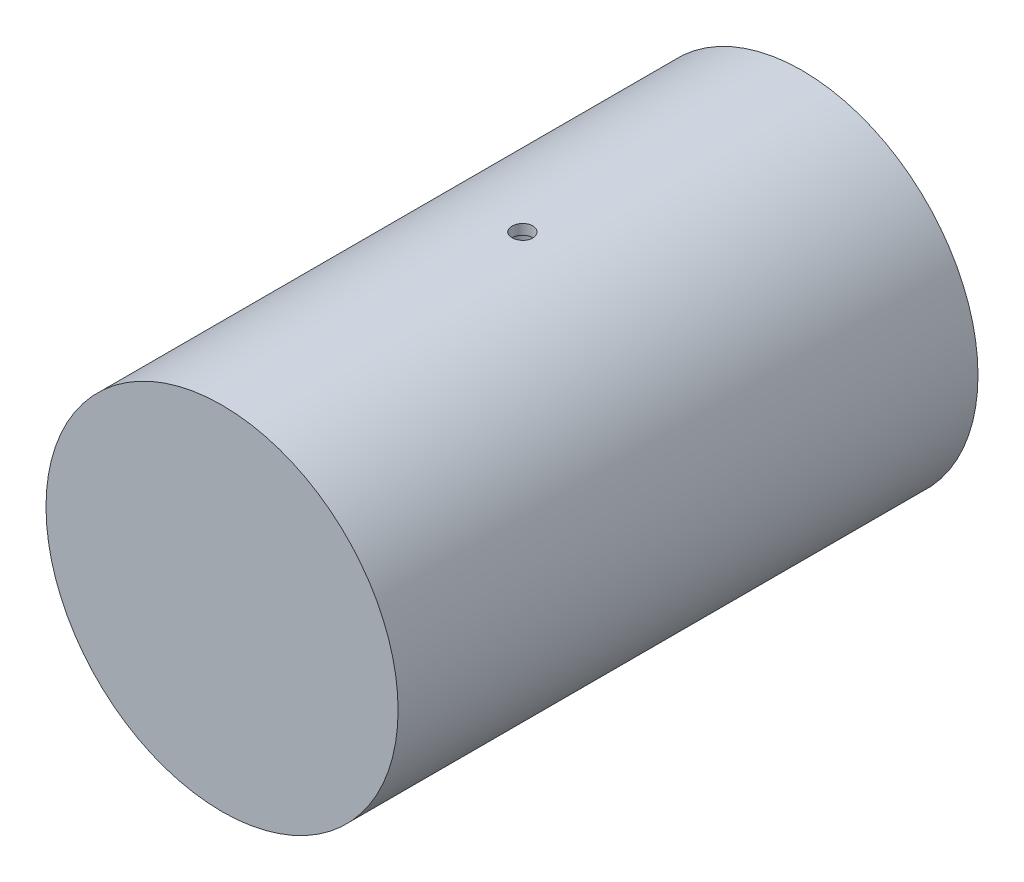
ISO-10303-21;
HEADER;
FILE_DESCRIPTION(('STEP AP214'),'2;1');
FILE_NAME('part.step','',(''),(''),'','','');
FILE_SCHEMA(('AUTOMOTIVE_DESIGN { 1 0 10303 214 1 1 1 1 }'));
ENDSEC;
DATA;
#1=APPLICATION_CONTEXT('core data for automotive mechanical design processes');
#2=APPLICATION_PROTOCOL_DEFINITION('international standard','automotive_design',2000,#1);
#3=PRODUCT_CONTEXT('',#1,'mechanical');
#4=PRODUCT('Part','Part','',(#3));
#5=PRODUCT_RELATED_PRODUCT_CATEGORY('part','',(#4));
#6=PRODUCT_DEFINITION_FORMATION('','',#4);
#7=PRODUCT_DEFINITION_CONTEXT('part definition',#1,'design');
#8=PRODUCT_DEFINITION('design','',#6,#7);
#9=PRODUCT_DEFINITION_SHAPE('','',#8);
#10=(LENGTH_UNIT() NAMED_UNIT(*) SI_UNIT(.MILLI.,.METRE.));
#11=(NAMED_UNIT(*) PLANE_ANGLE_UNIT() SI_UNIT($,.RADIAN.));
#12=(NAMED_UNIT(*) SI_UNIT($,.STERADIAN.) SOLID_ANGLE_UNIT());
#13=UNCERTAINTY_MEASURE_WITH_UNIT(LENGTH_MEASURE(1.E-05),#10,'distance_accuracy_value','');
#14=(GEOMETRIC_REPRESENTATION_CONTEXT(3) GLOBAL_UNCERTAINTY_ASSIGNED_CONTEXT((#13)) GLOBAL_UNIT_ASSIGNED_CONTEXT((#10,
#11,#12)) REPRESENTATION_CONTEXT('',''));
#15=CARTESIAN_POINT('',(0.,0.,0.));
#16=DIRECTION('',(0.,0.,1.));
#17=DIRECTION('',(1.,0.,0.));
#18=AXIS2_PLACEMENT_3D('',#15,#16,#17);
#19=CARTESIAN_POINT('',(0.,0.,-56.));
#20=DIRECTION('',(0.,0.,1.));
#21=DIRECTION('',(1.,0.,0.));
#22=AXIS2_PLACEMENT_3D('',#19,#20,#21);
#23=CYLINDRICAL_SURFACE('',#22,10.);
#24=CARTESIAN_POINT('',(0.,0.,-2.));
#25=DIRECTION('',(0.,0.,1.));
#26=DIRECTION('',(1.,0.,0.));
#27=AXIS2_PLACEMENT_3D('',#24,#25,#26);
#28=CIRCLE('',#27,10.);
#29=CARTESIAN_POINT('',(10.,0.,-2.));
#30=VERTEX_POINT('',#29);
#31=EDGE_CURVE('E213',#30,#30,#28,.T.);
#32=ORIENTED_EDGE('',*,*,#31,.T.);
#33=EDGE_LOOP('',(#32));
#34=FACE_BOUND('',#33,.T.);
#35=CARTESIAN_POINT('',(0.,10.,-27.5));
#36=CARTESIAN_POINT('',(-0.0837515444816424,9.99999865771297,-27.5000034538152));
#37=CARTESIAN_POINT('',(-0.167551685082132,9.9989368253704,-27.5070380008406));
#38=CARTESIAN_POINT('',(-0.332809627994914,9.99480315973187,-27.5349831999828));
#39=CARTESIAN_POINT('',(-0.41426506897423,9.99172936938473,-27.5559073629449));
#40=CARTESIAN_POINT('',(-0.572418086221861,9.98391721219526,-27.6109925049676));
#41=CARTESIAN_POINT('',(-0.649119207826801,9.97918010370919,-27.645143479506));
#42=CARTESIAN_POINT('',(-0.795690428635256,9.96856475911724,-27.7256883794169));
#43=CARTESIAN_POINT('',(-0.86556147472519,9.96268668152773,-27.7720806044174));
#44=CARTESIAN_POINT('',(-0.997046719562127,9.95039170991452,-27.8761772649399));
#45=CARTESIAN_POINT('',(-1.0585998322255,9.94397133890331,-27.9339584562082));
#46=CARTESIAN_POINT('',(-1.17117490668949,9.93134261133238,-28.0590276888939));
#47=CARTESIAN_POINT('',(-1.22219626272936,9.92513426698505,-28.1263162767785));
#48=CARTESIAN_POINT('',(-1.31249729499943,9.91359877458726,-28.2689006435225));
#49=CARTESIAN_POINT('',(-1.35171787037205,9.90827611975031,-28.3442342469813));
#50=CARTESIAN_POINT('',(-1.41692632171056,9.89916211306268,-28.5005128206454));
#51=CARTESIAN_POINT('',(-1.44291491889163,9.89537067775448,-28.5814574847439));
#52=CARTESIAN_POINT('',(-1.48073198798911,9.88978256218673,-28.7460180418717));
#53=CARTESIAN_POINT('',(-1.49266503640518,9.8879711574125,-28.829609393408));
#54=CARTESIAN_POINT('',(-1.50235624033933,9.88650348970582,-28.9976261659873));
#55=CARTESIAN_POINT('',(-1.50011520973796,9.88684710303147,-29.0820515388625));
#56=CARTESIAN_POINT('',(-1.48160733250788,9.88963718352409,-29.2486010801941));
#57=CARTESIAN_POINT('',(-1.4654569592775,9.89206618761549,-29.3307385264848));
#58=CARTESIAN_POINT('',(-1.41977117403734,9.89872608126367,-29.4911243688715));
#59=CARTESIAN_POINT('',(-1.39023538337812,9.90295702179379,-29.5693726548807));
#60=CARTESIAN_POINT('',(-1.31849603529737,9.91276335545481,-29.7201133712829));
#61=CARTESIAN_POINT('',(-1.27624314283198,9.91834396766526,-29.7925819690924));
#62=CARTESIAN_POINT('',(-1.18030413128955,9.93021707574548,-29.9294445957819));
#63=CARTESIAN_POINT('',(-1.12661726182478,9.93650961832501,-29.9938380942694));
#64=CARTESIAN_POINT('',(-1.00869493078248,9.94917473056209,-30.1133976607397));
#65=CARTESIAN_POINT('',(-0.944359329642003,9.95554747112815,-30.1684649902863));
#66=CARTESIAN_POINT('',(-0.807307089894186,9.96759647648462,-30.2670359345073));
#67=CARTESIAN_POINT('',(-0.73459041458817,9.9732727382251,-30.3105394985439));
#68=CARTESIAN_POINT('',(-0.582754598213685,9.98329515585393,-30.3847530864995));
#69=CARTESIAN_POINT('',(-0.503631677836779,9.98764051925428,-30.4154554918403));
#70=CARTESIAN_POINT('',(-0.34127318248706,9.99450490557069,-30.4631093896854));
#71=CARTESIAN_POINT('',(-0.2580378859526,9.99702405195467,-30.4800618118156));
#72=CARTESIAN_POINT('',(-0.0906695676436457,9.99993581133871,-30.4996032298167));
#73=CARTESIAN_POINT('',(-0.0065527318704695,10.0003485209039,-30.5023279713793));
#74=CARTESIAN_POINT('',(0.160936677662284,9.99905561015226,-30.493696994689));
#75=CARTESIAN_POINT('',(0.244309274381878,9.99735005541369,-30.4823417123319));
#76=CARTESIAN_POINT('',(0.40753238743141,9.99202468615333,-30.4459858998225));
#77=CARTESIAN_POINT('',(0.48739796307984,9.98841415207984,-30.4210515039692));
#78=CARTESIAN_POINT('',(0.641814958643002,9.97968235658369,-30.3583150025382));
#79=CARTESIAN_POINT('',(0.716366128795101,9.97456102421565,-30.3205122926664));
#80=CARTESIAN_POINT('',(0.858634979291923,9.96332682468686,-30.2327937754361));
#81=CARTESIAN_POINT('',(0.926299009891568,9.95720701626745,-30.1827918599872));
#82=CARTESIAN_POINT('',(1.05232367317771,9.94467863012165,-30.0722141883713));
#83=CARTESIAN_POINT('',(1.11068376479341,9.93827003562867,-30.0116378176753));
#84=CARTESIAN_POINT('',(1.21693784957196,9.92582264304494,-29.8810264668235));
#85=CARTESIAN_POINT('',(1.26474084747421,9.91978736017588,-29.8109170748052));
#86=CARTESIAN_POINT('',(1.34789129270584,9.90883219104903,-29.6635839594882));
#87=CARTESIAN_POINT('',(1.38323907656436,9.90391227465628,-29.5863604284785));
#88=CARTESIAN_POINT('',(1.44033467323943,9.89577033008645,-29.4272624663769));
#89=CARTESIAN_POINT('',(1.46213037141635,9.89254233006438,-29.3454055390288));
#90=CARTESIAN_POINT('',(1.49165549501586,9.88813382297802,-29.1791409845649));
#91=CARTESIAN_POINT('',(1.49938589183067,9.88695317451771,-29.0947335340053));
#92=CARTESIAN_POINT('',(1.5005378666944,9.88677832610841,-28.9266709366842));
#93=CARTESIAN_POINT('',(1.49410252167313,9.88776226333502,-28.8430167582431));
#94=CARTESIAN_POINT('',(1.46741229544379,9.89175820611174,-28.6779947366765));
#95=CARTESIAN_POINT('',(1.44715743638627,9.89477020841117,-28.5966268898866));
#96=CARTESIAN_POINT('',(1.39345373518665,9.90247526112297,-28.4385269177657));
#97=CARTESIAN_POINT('',(1.36001489324314,9.90716703716075,-28.3617913295666));
#98=CARTESIAN_POINT('',(1.28090667642309,9.91770454557702,-28.2149963661976));
#99=CARTESIAN_POINT('',(1.23523688741502,9.92355031702724,-28.1449372171964));
#100=CARTESIAN_POINT('',(1.13244337659164,9.93580743364938,-28.0127569420248));
#101=CARTESIAN_POINT('',(1.07521369039806,9.94222367881967,-27.9507186667529));
#102=CARTESIAN_POINT('',(0.951148841082837,9.95485788826636,-27.8370754452122));
#103=CARTESIAN_POINT('',(0.884311448350943,9.96107580610759,-27.7854729274238));
#104=CARTESIAN_POINT('',(0.742495707543723,9.9726518579052,-27.6939123233926));
#105=CARTESIAN_POINT('',(0.667474576764761,9.9780050712882,-27.6540198907853));
#106=CARTESIAN_POINT('',(0.51175187024872,9.98720028802959,-27.587461483242));
#107=CARTESIAN_POINT('',(0.431056277096705,9.99104385565757,-27.5607818099463));
#108=CARTESIAN_POINT('',(0.29166572788933,9.99590939261505,-27.5274586572899));
#109=CARTESIAN_POINT('',(0.233831133495279,9.99743549179557,-27.5171773984612));
#110=CARTESIAN_POINT('',(0.117338971600125,9.99948125947896,-27.5034469022874));
#111=CARTESIAN_POINT('',(0.0586814143344172,10.0000009404877,-27.4999975800475));
#112=CARTESIAN_POINT('',(0.,10.,-27.5));
#113=B_SPLINE_CURVE_WITH_KNOTS('',3,(#35,#36,#37,#38,#39,#40,#41,#42,#43,#44,#45,#46,#47,#48,
#49,#50,#51,#52,#53,#54,#55,#56,#57,#58,#59,#60,#61,#62,#63,#64,#65,#66,#67,#68,#69,#70,#71,#72,
#73,#74,#75,#76,#77,#78,#79,#80,#81,#82,#83,#84,#85,#86,#87,#88,#89,#90,#91,#92,#93,#94,#95,#96,
#97,#98,#99,#100,#101,#102,#103,#104,#105,#106,#107,#108,#109,#110,#111,#112),.UNSPECIFIED.,.T.,
.F.,(4,2,2,2,2,2,2,2,2,2,2,2,2,2,2,2,2,2,2,2,2,2,2,2,2,2,2,2,2,2,2,2,2,2,2,2,2,2,4),(0.,
0.251040205031664,0.502324962929151,0.753420023583239,1.0044802241976,1.25729416136843,
1.5101226357258,1.76419702395375,2.01825756225506,2.27041564605925,2.52255925098983,
2.77261177195747,3.02267136690361,3.27371383476159,3.52477278308535,3.77834291255409,
4.03191415238669,4.28563608984875,4.53934087193402,4.79062058544256,5.04189251991155,
5.29195148965949,5.54202220376274,5.79391188036908,6.0458162002863,6.29981366584672,
6.55380426808833,6.80689223457168,7.05996272137177,7.31048888261065,7.56101464229565,
7.81135073984148,8.06169531466881,8.31444829965721,8.56726003468734,8.82146323384734,
9.07540233261442,9.25129851978809,9.42719252123292),.UNSPECIFIED.);
#114=CARTESIAN_POINT('',(0.,10.,-27.5));
#115=VERTEX_POINT('',#114);
#116=EDGE_CURVE('E141',#115,#115,#113,.T.);
#117=ORIENTED_EDGE('',*,*,#116,.F.);
#118=EDGE_LOOP('',(#117));
#119=FACE_BOUND('',#118,.T.);
#120=CARTESIAN_POINT('',(0.,0.,-54.));
#121=DIRECTION('',(0.,0.,-1.));
#122=DIRECTION('',(-1.,0.,0.));
#123=AXIS2_PLACEMENT_3D('',#120,#121,#122);
#124=CIRCLE('',#123,10.);
#125=CARTESIAN_POINT('',(-10.,0.,-54.));
#126=VERTEX_POINT('',#125);
#127=EDGE_CURVE('E53',#126,#126,#124,.F.);
#128=ORIENTED_EDGE('',*,*,#127,.F.);
#129=EDGE_LOOP('',(#128));
#130=FACE_BOUND('',#129,.T.);
#131=ADVANCED_FACE('F39',(#34,#119,#130),#23,.F.);
#132=CARTESIAN_POINT('',(0.,0.,-2.));
#133=DIRECTION('',(0.,0.,1.));
#134=DIRECTION('',(1.,0.,0.));
#135=AXIS2_PLACEMENT_3D('',#132,#133,#134);
#136=PLANE('',#135);
#137=ORIENTED_EDGE('',*,*,#31,.F.);
#138=EDGE_LOOP('',(#137));
#139=FACE_BOUND('',#138,.T.);
#140=ADVANCED_FACE('F166',(#139),#136,.F.);
#141=CARTESIAN_POINT('',(0.,16.,0.));
#142=DIRECTION('',(0.,1.,0.));
#143=DIRECTION('',(0.,0.,1.));
#144=AXIS2_PLACEMENT_3D('',#141,#142,#143);
#145=PLANE('',#144);
#146=CARTESIAN_POINT('',(0.,16.,-29.));
#147=DIRECTION('',(0.,1.,0.));
#148=DIRECTION('',(0.,0.,1.));
#149=AXIS2_PLACEMENT_3D('',#146,#147,#148);
#150=CIRCLE('',#149,1.);
#151=CARTESIAN_POINT('',(0.,16.,-28.));
#152=VERTEX_POINT('',#151);
#153=EDGE_CURVE('E133',#152,#152,#150,.F.);
#154=ORIENTED_EDGE('',*,*,#153,.F.);
#155=EDGE_LOOP('',(#154));
#156=FACE_BOUND('',#155,.T.);
#157=CARTESIAN_POINT('',(0.,16.,-29.));
#158=DIRECTION('',(0.,1.,0.));
#159=DIRECTION('',(0.,0.,1.));
#160=AXIS2_PLACEMENT_3D('',#157,#158,#159);
#161=CIRCLE('',#160,1.5);
#162=CARTESIAN_POINT('',(0.,16.,-27.5));
#163=VERTEX_POINT('',#162);
#164=EDGE_CURVE('E156',#163,#163,#161,.T.);
#165=ORIENTED_EDGE('',*,*,#164,.F.);
#166=EDGE_LOOP('',(#165));
#167=FACE_BOUND('',#166,.T.);
#168=ADVANCED_FACE('F163',(#156,#167),#145,.F.);
#169=CARTESIAN_POINT('',(0.,-17.001,-29.));
#170=DIRECTION('',(0.,1.,0.));
#171=DIRECTION('',(0.,0.,1.));
#172=AXIS2_PLACEMENT_3D('',#169,#170,#171);
#173=CYLINDRICAL_SURFACE('',#172,1.5);
#174=ORIENTED_EDGE('',*,*,#164,.T.);
#175=EDGE_LOOP('',(#174));
#176=FACE_BOUND('',#175,.T.);
#177=ORIENTED_EDGE('',*,*,#116,.T.);
#178=EDGE_LOOP('',(#177));
#179=FACE_BOUND('',#178,.T.);
#180=ADVANCED_FACE('F158',(#176,#179),#173,.F.);
#181=CARTESIAN_POINT('',(0.,0.,-54.));
#182=DIRECTION('',(0.,0.,-1.));
#183=DIRECTION('',(-1.,0.,0.));
#184=AXIS2_PLACEMENT_3D('',#181,#182,#183);
#185=CYLINDRICAL_SURFACE('',#184,5.);
#186=CARTESIAN_POINT('',(0.,0.,-56.));
#187=DIRECTION('',(0.,0.,-1.));
#188=DIRECTION('',(-1.,0.,0.));
#189=AXIS2_PLACEMENT_3D('',#186,#187,#188);
#190=CIRCLE('',#189,5.);
#191=CARTESIAN_POINT('',(1.95959179422654,4.6,-56.));
#192=VERTEX_POINT('',#191);
#193=CARTESIAN_POINT('',(4.78340576371954,-1.45568859980928,-56.));
#194=VERTEX_POINT('',#193);
#195=EDGE_CURVE('E129',#192,#194,#190,.T.);
#196=ORIENTED_EDGE('',*,*,#195,.T.);
#197=DIRECTION('',(0.,0.,-1.));
#198=VECTOR('',#197,1.);
#199=CARTESIAN_POINT('',(4.78340576371954,-1.45568859980928,-54.));
#200=LINE('',#199,#198);
#201=CARTESIAN_POINT('',(4.78340576371954,-1.45568859980928,-54.));
#202=VERTEX_POINT('',#201);
#203=EDGE_CURVE('E139',#202,#194,#200,.T.);
#204=ORIENTED_EDGE('',*,*,#203,.F.);
#205=CARTESIAN_POINT('',(0.,0.,-54.));
#206=DIRECTION('',(0.,0.,-1.));
#207=DIRECTION('',(-1.,0.,0.));
#208=AXIS2_PLACEMENT_3D('',#205,#206,#207);
#209=CIRCLE('',#208,5.);
#210=CARTESIAN_POINT('',(1.95959179422654,4.6,-54.));
#211=VERTEX_POINT('',#210);
#212=EDGE_CURVE('E111',#211,#202,#209,.T.);
#213=ORIENTED_EDGE('',*,*,#212,.F.);
#214=DIRECTION('',(0.,0.,-1.));
#215=VECTOR('',#214,1.);
#216=CARTESIAN_POINT('',(1.95959179422654,4.6,-54.));
#217=LINE('',#216,#215);
#218=EDGE_CURVE('E128',#211,#192,#217,.T.);
#219=ORIENTED_EDGE('',*,*,#218,.T.);
#220=EDGE_LOOP('',(#196,#204,#213,#219));
#221=FACE_BOUND('',#220,.T.);
#222=ADVANCED_FACE('F178',(#221),#185,.F.);
#223=CARTESIAN_POINT('',(3.8302222155949,-3.21393804843269,-54.));
#224=DIRECTION('',(0.,0.,-1.));
#225=DIRECTION('',(-1.,0.,0.));
#226=AXIS2_PLACEMENT_3D('',#223,#224,#225);
#227=CYLINDRICAL_SURFACE('',#226,2.);
#228=CARTESIAN_POINT('',(3.8302222155949,-3.21393804843269,-56.));
#229=DIRECTION('',(0.,0.,-1.));
#230=DIRECTION('',(-1.,0.,0.));
#231=AXIS2_PLACEMENT_3D('',#228,#229,#230);
#232=CIRCLE('',#231,2.);
#233=CARTESIAN_POINT('',(2.26420311297507,-4.45795740930687,-56.));
#234=VERTEX_POINT('',#233);
#235=EDGE_CURVE('E81',#194,#234,#232,.T.);
#236=ORIENTED_EDGE('',*,*,#235,.T.);
#237=DIRECTION('',(0.,0.,-1.));
#238=VECTOR('',#237,1.);
#239=CARTESIAN_POINT('',(2.26420311297507,-4.45795740930687,-54.));
#240=LINE('',#239,#238);
#241=CARTESIAN_POINT('',(2.26420311297507,-4.45795740930687,-54.));
#242=VERTEX_POINT('',#241);
#243=EDGE_CURVE('E118',#242,#234,#240,.T.);
#244=ORIENTED_EDGE('',*,*,#243,.F.);
#245=CARTESIAN_POINT('',(3.8302222155949,-3.21393804843269,-54.));
#246=DIRECTION('',(0.,0.,-1.));
#247=DIRECTION('',(-1.,0.,0.));
#248=AXIS2_PLACEMENT_3D('',#245,#246,#247);
#249=CIRCLE('',#248,2.);
#250=EDGE_CURVE('E61',#202,#242,#249,.T.);
#251=ORIENTED_EDGE('',*,*,#250,.F.);
#252=ORIENTED_EDGE('',*,*,#203,.T.);
#253=EDGE_LOOP('',(#236,#244,#251,#252));
#254=FACE_BOUND('',#253,.T.);
#255=ADVANCED_FACE('F177',(#254),#227,.F.);
#256=CARTESIAN_POINT('',(-2.26420311297507,-4.45795740930687,-56.));
#257=VERTEX_POINT('',#256);
#258=EDGE_CURVE('E115',#234,#257,#190,.T.);
#259=ORIENTED_EDGE('',*,*,#258,.T.);
#260=DIRECTION('',(0.,0.,-1.));
#261=VECTOR('',#260,1.);
#262=CARTESIAN_POINT('',(-2.26420311297507,-4.45795740930687,-54.));
#263=LINE('',#262,#261);
#264=CARTESIAN_POINT('',(-2.26420311297507,-4.45795740930687,-54.));
#265=VERTEX_POINT('',#264);
#266=EDGE_CURVE('E113',#265,#257,#263,.T.);
#267=ORIENTED_EDGE('',*,*,#266,.F.);
#268=EDGE_CURVE('E101',#242,#265,#209,.T.);
#269=ORIENTED_EDGE('',*,*,#268,.F.);
#270=ORIENTED_EDGE('',*,*,#243,.T.);
#271=EDGE_LOOP('',(#259,#267,#269,#270));
#272=FACE_BOUND('',#271,.T.);
#273=ADVANCED_FACE('F114',(#272),#185,.F.);
#274=CARTESIAN_POINT('',(-3.8302222155949,-3.21393804843269,-54.));
#275=DIRECTION('',(0.,0.,-1.));
#276=DIRECTION('',(-1.,0.,0.));
#277=AXIS2_PLACEMENT_3D('',#274,#275,#276);
#278=CYLINDRICAL_SURFACE('',#277,2.);
#279=CARTESIAN_POINT('',(-3.8302222155949,-3.21393804843269,-56.));
#280=DIRECTION('',(0.,0.,-1.));
#281=DIRECTION('',(-1.,0.,0.));
#282=AXIS2_PLACEMENT_3D('',#279,#280,#281);
#283=CIRCLE('',#282,2.);
#284=CARTESIAN_POINT('',(-4.78340576371954,-1.45568859980928,-56.));
#285=VERTEX_POINT('',#284);
#286=EDGE_CURVE('E136',#257,#285,#283,.T.);
#287=ORIENTED_EDGE('',*,*,#286,.T.);
#288=DIRECTION('',(0.,0.,-1.));
#289=VECTOR('',#288,1.);
#290=CARTESIAN_POINT('',(-4.78340576371954,-1.45568859980928,-54.));
#291=LINE('',#290,#289);
#292=CARTESIAN_POINT('',(-4.78340576371954,-1.45568859980928,-54.));
#293=VERTEX_POINT('',#292);
#294=EDGE_CURVE('E119',#293,#285,#291,.T.);
#295=ORIENTED_EDGE('',*,*,#294,.F.);
#296=CARTESIAN_POINT('',(-3.8302222155949,-3.21393804843269,-54.));
#297=DIRECTION('',(0.,0.,-1.));
#298=DIRECTION('',(-1.,0.,0.));
#299=AXIS2_PLACEMENT_3D('',#296,#297,#298);
#300=CIRCLE('',#299,2.);
#301=EDGE_CURVE('E106',#265,#293,#300,.T.);
#302=ORIENTED_EDGE('',*,*,#301,.F.);
#303=ORIENTED_EDGE('',*,*,#266,.T.);
#304=EDGE_LOOP('',(#287,#295,#302,#303));
#305=FACE_BOUND('',#304,.T.);
#306=ADVANCED_FACE('F121',(#305),#278,.F.);
#307=CARTESIAN_POINT('',(-1.95959179422654,4.6,-56.));
#308=VERTEX_POINT('',#307);
#309=EDGE_CURVE('E134',#285,#308,#190,.T.);
#310=ORIENTED_EDGE('',*,*,#309,.T.);
#311=DIRECTION('',(0.,0.,-1.));
#312=VECTOR('',#311,1.);
#313=CARTESIAN_POINT('',(-1.95959179422654,4.6,-54.));
#314=LINE('',#313,#312);
#315=CARTESIAN_POINT('',(-1.95959179422654,4.6,-54.));
#316=VERTEX_POINT('',#315);
#317=EDGE_CURVE('E144',#316,#308,#314,.T.);
#318=ORIENTED_EDGE('',*,*,#317,.F.);
#319=EDGE_CURVE('E110',#293,#316,#209,.T.);
#320=ORIENTED_EDGE('',*,*,#319,.F.);
#321=ORIENTED_EDGE('',*,*,#294,.T.);
#322=EDGE_LOOP('',(#310,#318,#320,#321));
#323=FACE_BOUND('',#322,.T.);
#324=ADVANCED_FACE('F171',(#323),#185,.F.);
#325=CARTESIAN_POINT('',(0.,5.,-54.));
#326=DIRECTION('',(0.,0.,-1.));
#327=DIRECTION('',(-1.,0.,0.));
#328=AXIS2_PLACEMENT_3D('',#325,#326,#327);
#329=CYLINDRICAL_SURFACE('',#328,2.);
#330=CARTESIAN_POINT('',(0.,5.,-56.));
#331=DIRECTION('',(0.,0.,-1.));
#332=DIRECTION('',(-1.,0.,0.));
#333=AXIS2_PLACEMENT_3D('',#330,#331,#332);
#334=CIRCLE('',#333,2.);
#335=EDGE_CURVE('E132',#308,#192,#334,.T.);
#336=ORIENTED_EDGE('',*,*,#335,.T.);
#337=ORIENTED_EDGE('',*,*,#218,.F.);
#338=CARTESIAN_POINT('',(0.,5.,-54.));
#339=DIRECTION('',(0.,0.,-1.));
#340=DIRECTION('',(-1.,0.,0.));
#341=AXIS2_PLACEMENT_3D('',#338,#339,#340);
#342=CIRCLE('',#341,2.);
#343=EDGE_CURVE('E93',#316,#211,#342,.T.);
#344=ORIENTED_EDGE('',*,*,#343,.F.);
#345=ORIENTED_EDGE('',*,*,#317,.T.);
#346=EDGE_LOOP('',(#336,#337,#344,#345));
#347=FACE_BOUND('',#346,.T.);
#348=ADVANCED_FACE('F168',(#347),#329,.F.);
#349=CARTESIAN_POINT('',(0.,0.,-54.));
#350=DIRECTION('',(0.,0.,-1.));
#351=DIRECTION('',(-1.,0.,0.));
#352=AXIS2_PLACEMENT_3D('',#349,#350,#351);
#353=PLANE('',#352);
#354=ORIENTED_EDGE('',*,*,#212,.T.);
#355=ORIENTED_EDGE('',*,*,#250,.T.);
#356=ORIENTED_EDGE('',*,*,#268,.T.);
#357=ORIENTED_EDGE('',*,*,#301,.T.);
#358=ORIENTED_EDGE('',*,*,#319,.T.);
#359=ORIENTED_EDGE('',*,*,#343,.T.);
#360=EDGE_LOOP('',(#354,#355,#356,#357,#358,#359));
#361=FACE_BOUND('',#360,.T.);
#362=ORIENTED_EDGE('',*,*,#127,.T.);
#363=EDGE_LOOP('',(#362));
#364=FACE_BOUND('',#363,.T.);
#365=ADVANCED_FACE('F103',(#361,#364),#353,.F.);
#366=CARTESIAN_POINT('',(0.,0.,0.));
#367=DIRECTION('',(0.,0.,1.));
#368=DIRECTION('',(1.,0.,0.));
#369=AXIS2_PLACEMENT_3D('',#366,#367,#368);
#370=PLANE('',#369);
#371=CARTESIAN_POINT('',(0.,0.,0.));
#372=DIRECTION('',(0.,0.,1.));
#373=DIRECTION('',(1.,0.,0.));
#374=AXIS2_PLACEMENT_3D('',#371,#372,#373);
#375=CIRCLE('',#374,17.);
#376=CARTESIAN_POINT('',(17.,0.,0.));
#377=VERTEX_POINT('',#376);
#378=EDGE_CURVE('E211',#377,#377,#375,.T.);
#379=ORIENTED_EDGE('',*,*,#378,.T.);
#380=EDGE_LOOP('',(#379));
#381=FACE_BOUND('',#380,.T.);
#382=ADVANCED_FACE('F182',(#381),#370,.T.);
#383=CARTESIAN_POINT('',(0.,0.,-2.));
#384=DIRECTION('',(0.,0.,1.));
#385=DIRECTION('',(1.,0.,0.));
#386=AXIS2_PLACEMENT_3D('',#383,#384,#385);
#387=CYLINDRICAL_SURFACE('',#386,17.);
#388=CARTESIAN_POINT('',(0.,17.,-28.));
#389=CARTESIAN_POINT('',(0.0561183746501264,16.9999996082067,-28.0000024716357));
#390=CARTESIAN_POINT('',(0.112276202860598,16.9997191499508,-28.0047397791588));
#391=CARTESIAN_POINT('',(0.223041674009741,16.9986273089947,-28.023570099752));
#392=CARTESIAN_POINT('',(0.277647427794243,16.99781530595,-28.0376740445267));
#393=CARTESIAN_POINT('',(0.38368824240781,16.995752249275,-28.0748315492316));
#394=CARTESIAN_POINT('',(0.435124941635176,16.9945014247927,-28.0978804388714));
#395=CARTESIAN_POINT('',(0.533385723026011,16.9917014683063,-28.1522661123082));
#396=CARTESIAN_POINT('',(0.580210868421177,16.9901524053082,-28.1836009795363));
#397=CARTESIAN_POINT('',(0.667995846390313,16.9869278107431,-28.253715430904));
#398=CARTESIAN_POINT('',(0.708948680843567,16.9852521318566,-28.2925037707974));
#399=CARTESIAN_POINT('',(0.7837667438938,16.981964425654,-28.3764062019085));
#400=CARTESIAN_POINT('',(0.81763167845635,16.9803524009807,-28.4215205554249));
#401=CARTESIAN_POINT('',(0.87733364496531,16.9773726782667,-28.516833291706));
#402=CARTESIAN_POINT('',(0.90316494942709,16.9760051548342,-28.5670352679796));
#403=CARTESIAN_POINT('',(0.946029728558036,16.9736705291336,-28.6710729792676));
#404=CARTESIAN_POINT('',(0.963063288989445,16.9727034229622,-28.7249086788539));
#405=CARTESIAN_POINT('',(0.987829865943245,16.9712800777172,-28.8346189583736));
#406=CARTESIAN_POINT('',(0.995573725716119,16.9708232430806,-28.8904910826436));
#407=CARTESIAN_POINT('',(1.00157454952996,16.9704701732292,-29.0027439105296));
#408=CARTESIAN_POINT('',(0.999831610675698,16.9705739322763,-29.0591246089339));
#409=CARTESIAN_POINT('',(0.986917320304146,16.9713297958248,-29.1707203170552));
#410=CARTESIAN_POINT('',(0.975757696579302,16.9719812182477,-29.2259366892192));
#411=CARTESIAN_POINT('',(0.94434500290671,16.9737579197931,-29.3337110780658));
#412=CARTESIAN_POINT('',(0.924091883555518,16.9748832014898,-29.3862690803043));
#413=CARTESIAN_POINT('',(0.875053770991126,16.9774815896434,-29.4872725128612));
#414=CARTESIAN_POINT('',(0.846263449215765,16.9789549132162,-29.5357153503011));
#415=CARTESIAN_POINT('',(0.78097205059819,16.9820831249695,-29.6270849885991));
#416=CARTESIAN_POINT('',(0.744470897297473,16.9837380149503,-29.6700117347543));
#417=CARTESIAN_POINT('',(0.664727875730669,16.9870458854863,-29.7491988998026));
#418=CARTESIAN_POINT('',(0.621475855871977,16.9886988593262,-29.7854490969132));
#419=CARTESIAN_POINT('',(0.529494483315231,16.9918141927135,-29.8501753337895));
#420=CARTESIAN_POINT('',(0.480765128899694,16.9932765522012,-29.8786513711176));
#421=CARTESIAN_POINT('',(0.379206204412818,16.9958459622978,-29.9270200568789));
#422=CARTESIAN_POINT('',(0.326376454135523,16.9969529972799,-29.9469123278169));
#423=CARTESIAN_POINT('',(0.218119112458328,16.9986867904689,-29.9775420306861));
#424=CARTESIAN_POINT('',(0.162691547948043,16.999313553646,-29.9882795573548));
#425=CARTESIAN_POINT('',(0.050900666474477,17.0000155334865,-30.0002823282654));
#426=CARTESIAN_POINT('',(-0.005461127958274,17.0000915731607,-30.0015617069878));
#427=CARTESIAN_POINT('',(-0.1175985454968,16.9996857248861,-29.9946487821063));
#428=CARTESIAN_POINT('',(-0.173374171298664,16.9992038395046,-29.9864565220866));
#429=CARTESIAN_POINT('',(-0.282716235495461,16.9977369278617,-29.9608445697599));
#430=CARTESIAN_POINT('',(-0.336284195719763,16.9967522546801,-29.9434313524977));
#431=CARTESIAN_POINT('',(-0.439737273498814,16.9943905722397,-29.8998783554226));
#432=CARTESIAN_POINT('',(-0.489622361686738,16.9930135598529,-29.8737385060336));
#433=CARTESIAN_POINT('',(-0.584358423026641,16.9900199316599,-29.8134382121784));
#434=CARTESIAN_POINT('',(-0.629203371432839,16.9884030343495,-29.7792683165885));
#435=CARTESIAN_POINT('',(-0.712525543101089,16.9851125847618,-29.7038916612643));
#436=CARTESIAN_POINT('',(-0.751002710614035,16.9834390319887,-29.662684839929));
#437=CARTESIAN_POINT('',(-0.820544882253057,16.9802215212302,-29.574343117712));
#438=CARTESIAN_POINT('',(-0.851600724421362,16.978677724943,-29.5272009978921));
#439=CARTESIAN_POINT('',(-0.905356030704418,16.9758963846561,-29.4283632127282));
#440=CARTESIAN_POINT('',(-0.928055541566714,16.9746588389431,-29.3766675728599));
#441=CARTESIAN_POINT('',(-0.964437928879209,16.9726307209231,-29.270223813434));
#442=CARTESIAN_POINT('',(-0.97812659534078,16.9718398616394,-29.2154776785844));
#443=CARTESIAN_POINT('',(-0.996117641244239,16.9707935026047,-29.1044593375797));
#444=CARTESIAN_POINT('',(-1.00042010116884,16.9705379982633,-29.0481871445141));
#445=CARTESIAN_POINT('',(-0.999515838122645,16.9705912734493,-28.935805174045));
#446=CARTESIAN_POINT('',(-0.994323521596244,16.9708991980853,-28.8796952797475));
#447=CARTESIAN_POINT('',(-0.974606937601246,16.9720428201189,-28.7691454304075));
#448=CARTESIAN_POINT('',(-0.96008265292127,16.9728785184899,-28.7147054784451));
#449=CARTESIAN_POINT('',(-0.922117583314701,16.9749833032909,-28.6090384526631));
#450=CARTESIAN_POINT('',(-0.898676815664675,16.9762523888812,-28.5578113726184));
#451=CARTESIAN_POINT('',(-0.843546281111595,16.9790808989316,-28.4600182342922));
#452=CARTESIAN_POINT('',(-0.811856740354144,16.9806403154317,-28.4134520482776));
#453=CARTESIAN_POINT('',(-0.741075329876088,16.9838764922282,-28.3262297411644));
#454=CARTESIAN_POINT('',(-0.701973132288073,16.9855534141621,-28.2855820074944));
#455=CARTESIAN_POINT('',(-0.617488612819354,16.9888343021954,-28.2114140992484));
#456=CARTESIAN_POINT('',(-0.572104754109951,16.9904382503136,-28.1778956739867));
#457=CARTESIAN_POINT('',(-0.476298644798581,16.9933939396066,-28.1189160450468));
#458=CARTESIAN_POINT('',(-0.425870669756793,16.9947453891248,-28.0934641355258));
#459=CARTESIAN_POINT('',(-0.321486229260541,16.9970397610062,-28.0514192433704));
#460=CARTESIAN_POINT('',(-0.267533991546778,16.9979831628725,-28.0348158573422));
#461=CARTESIAN_POINT('',(-0.177708363856153,16.9991071850645,-28.0152672896781));
#462=CARTESIAN_POINT('',(-0.142415986844461,16.9994405079764,-28.0095494294173));
#463=CARTESIAN_POINT('',(-0.0714210672826123,16.9998870399963,-28.0019150002994));
#464=CARTESIAN_POINT('',(-0.0357185252291029,17.0000002493707,-27.99999842684));
#465=CARTESIAN_POINT('',(0.,17.,-28.));
#466=B_SPLINE_CURVE_WITH_KNOTS('',3,(#388,#389,#390,#391,#392,#393,#394,#395,#396,#397,#398,
#399,#400,#401,#402,#403,#404,#405,#406,#407,#408,#409,#410,#411,#412,#413,#414,#415,#416,#417,
#418,#419,#420,#421,#422,#423,#424,#425,#426,#427,#428,#429,#430,#431,#432,#433,#434,#435,#436,
#437,#438,#439,#440,#441,#442,#443,#444,#445,#446,#447,#448,#449,#450,#451,#452,#453,#454,#455,
#456,#457,#458,#459,#460,#461,#462,#463,#464,#465),.UNSPECIFIED.,.T.,.F.,(4,2,2,2,2,2,2,2,2,2,2,
2,2,2,2,2,2,2,2,2,2,2,2,2,2,2,2,2,2,2,2,2,2,2,2,2,2,2,4),(0.,0.168224732642648,
0.336646144457545,0.504979738968159,0.673274431475586,0.841768045505397,1.01026864793928,
1.17888910701349,1.34750792230927,1.51592972796072,1.68434980968695,1.85256044557549,
2.02077199533541,2.18908875744697,2.35740718861998,2.52598121089487,2.69455528602827,
2.86313677392696,3.03171651724715,3.20004427997714,3.36837126814283,3.5365802119171,
3.7047904968266,3.87319976059687,4.04161049869066,4.21022808551262,4.37884472902851,
4.54735292013826,4.71585966635655,4.88411094904949,5.05236254205688,5.22061380906182,
5.38886046383207,5.55734327857491,5.72586738628295,5.89458496572892,6.06310374031495,
6.17017645347565,6.27724903700141),.UNSPECIFIED.);
#467=CARTESIAN_POINT('',(0.,17.,-28.));
#468=VERTEX_POINT('',#467);
#469=EDGE_CURVE('E11',#468,#468,#466,.T.);
#470=ORIENTED_EDGE('',*,*,#469,.F.);
#471=EDGE_LOOP('',(#470));
#472=FACE_BOUND('',#471,.T.);
#473=ORIENTED_EDGE('',*,*,#378,.F.);
#474=EDGE_LOOP('',(#473));
#475=FACE_BOUND('',#474,.T.);
#476=CARTESIAN_POINT('',(0.,0.,-56.));
#477=DIRECTION('',(0.,0.,1.));
#478=DIRECTION('',(1.,0.,0.));
#479=AXIS2_PLACEMENT_3D('',#476,#477,#478);
#480=CIRCLE('',#479,17.);
#481=CARTESIAN_POINT('',(17.,0.,-56.));
#482=VERTEX_POINT('',#481);
#483=EDGE_CURVE('E214',#482,#482,#480,.T.);
#484=ORIENTED_EDGE('',*,*,#483,.T.);
#485=EDGE_LOOP('',(#484));
#486=FACE_BOUND('',#485,.T.);
#487=ADVANCED_FACE('F41',(#472,#475,#486),#387,.T.);
#488=CARTESIAN_POINT('',(0.,0.,-56.));
#489=DIRECTION('',(0.,0.,1.));
#490=DIRECTION('',(1.,0.,0.));
#491=AXIS2_PLACEMENT_3D('',#488,#489,#490);
#492=PLANE('',#491);
#493=ORIENTED_EDGE('',*,*,#483,.F.);
#494=EDGE_LOOP('',(#493));
#495=FACE_BOUND('',#494,.T.);
#496=ORIENTED_EDGE('',*,*,#195,.F.);
#497=ORIENTED_EDGE('',*,*,#335,.F.);
#498=ORIENTED_EDGE('',*,*,#309,.F.);
#499=ORIENTED_EDGE('',*,*,#286,.F.);
#500=ORIENTED_EDGE('',*,*,#258,.F.);
#501=ORIENTED_EDGE('',*,*,#235,.F.);
#502=EDGE_LOOP('',(#496,#497,#498,#499,#500,#501));
#503=FACE_BOUND('',#502,.T.);
#504=ADVANCED_FACE('F186',(#495,#503),#492,.F.);
#505=CARTESIAN_POINT('',(0.,13.1715728752538,-29.));
#506=DIRECTION('',(0.,1.,0.));
#507=DIRECTION('',(0.,0.,1.));
#508=AXIS2_PLACEMENT_3D('',#505,#506,#507);
#509=CYLINDRICAL_SURFACE('',#508,1.);
#510=ORIENTED_EDGE('',*,*,#469,.T.);
#511=EDGE_LOOP('',(#510));
#512=FACE_BOUND('',#511,.T.);
#513=ORIENTED_EDGE('',*,*,#153,.T.);
#514=EDGE_LOOP('',(#513));
#515=FACE_BOUND('',#514,.T.);
#516=ADVANCED_FACE('F183',(#512,#515),#509,.F.);
#517=CLOSED_SHELL('',(#131,#140,#168,#180,#222,#255,#273,#306,#324,#348,#365,#382,#487,#504,#516));
#518=MANIFOLD_SOLID_BREP('B2',#517);
#519=ADVANCED_BREP_SHAPE_REPRESENTATION('',(#18,#518),#14);
#520=SHAPE_DEFINITION_REPRESENTATION(#9,#519);
ENDSEC;
END-ISO-10303-21;
